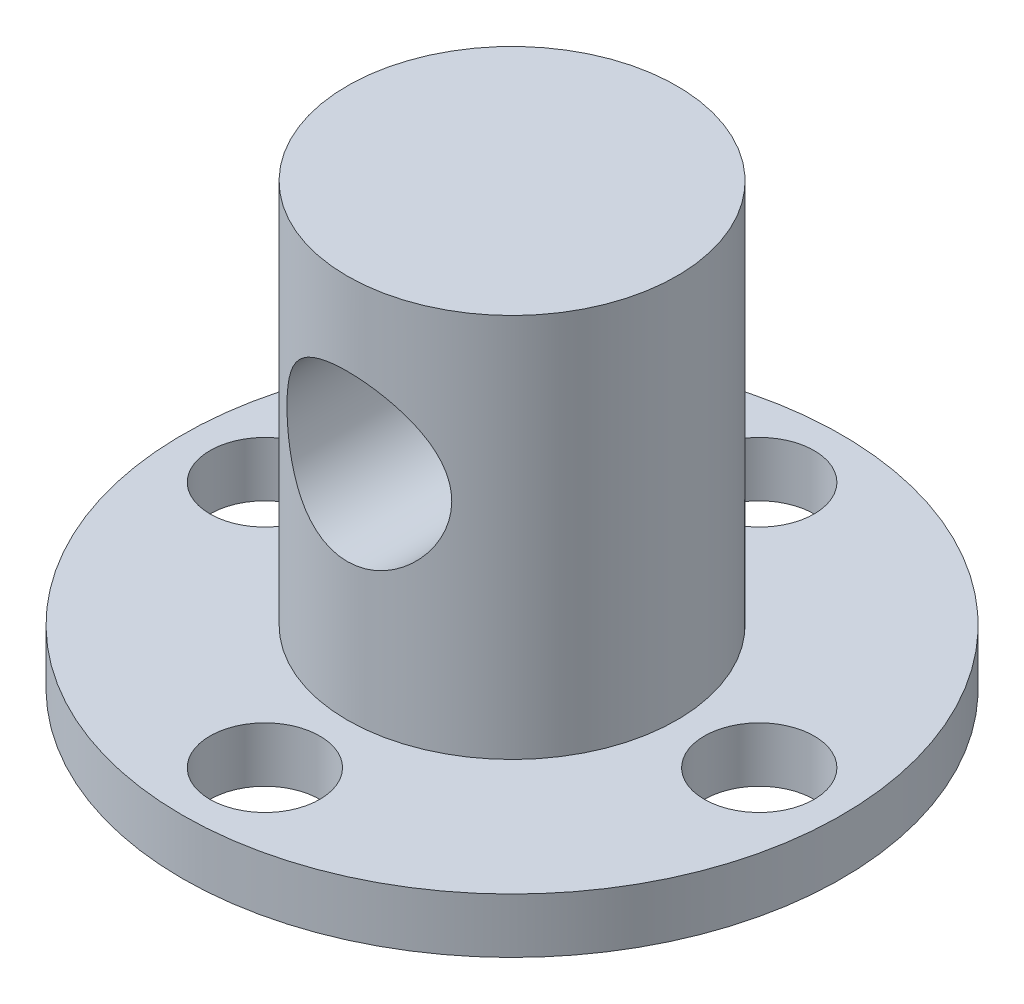
ISO-10303-21;
HEADER;
FILE_DESCRIPTION(('STEP AP214'),'2;1');
FILE_NAME('part.step','',(''),(''),'','','');
FILE_SCHEMA(('AUTOMOTIVE_DESIGN { 1 0 10303 214 1 1 1 1 }'));
ENDSEC;
DATA;
#1=APPLICATION_CONTEXT('core data for automotive mechanical design processes');
#2=APPLICATION_PROTOCOL_DEFINITION('international standard','automotive_design',2000,#1);
#3=PRODUCT_CONTEXT('',#1,'mechanical');
#4=PRODUCT('Part','Part','',(#3));
#5=PRODUCT_RELATED_PRODUCT_CATEGORY('part','',(#4));
#6=PRODUCT_DEFINITION_FORMATION('','',#4);
#7=PRODUCT_DEFINITION_CONTEXT('part definition',#1,'design');
#8=PRODUCT_DEFINITION('design','',#6,#7);
#9=PRODUCT_DEFINITION_SHAPE('','',#8);
#10=(LENGTH_UNIT() NAMED_UNIT(*) SI_UNIT(.MILLI.,.METRE.));
#11=(NAMED_UNIT(*) PLANE_ANGLE_UNIT() SI_UNIT($,.RADIAN.));
#12=(NAMED_UNIT(*) SI_UNIT($,.STERADIAN.) SOLID_ANGLE_UNIT());
#13=UNCERTAINTY_MEASURE_WITH_UNIT(LENGTH_MEASURE(1.E-05),#10,'distance_accuracy_value','');
#14=(GEOMETRIC_REPRESENTATION_CONTEXT(3) GLOBAL_UNCERTAINTY_ASSIGNED_CONTEXT((#13)) GLOBAL_UNIT_ASSIGNED_CONTEXT((#10,
#11,#12)) REPRESENTATION_CONTEXT('',''));
#15=CARTESIAN_POINT('',(0.,0.,0.));
#16=DIRECTION('',(0.,0.,1.));
#17=DIRECTION('',(1.,0.,0.));
#18=AXIS2_PLACEMENT_3D('',#15,#16,#17);
#19=CARTESIAN_POINT('',(0.,5.,0.));
#20=DIRECTION('',(0.,-1.,0.));
#21=DIRECTION('',(0.,0.,-1.));
#22=AXIS2_PLACEMENT_3D('',#19,#20,#21);
#23=CYLINDRICAL_SURFACE('',#22,30.);
#24=CARTESIAN_POINT('',(0.,5.,0.));
#25=DIRECTION('',(0.,1.,0.));
#26=DIRECTION('',(0.,0.,1.));
#27=AXIS2_PLACEMENT_3D('',#24,#25,#26);
#28=CIRCLE('',#27,30.);
#29=CARTESIAN_POINT('',(0.,5.,30.));
#30=VERTEX_POINT('',#29);
#31=EDGE_CURVE('E43',#30,#30,#28,.T.);
#32=ORIENTED_EDGE('',*,*,#31,.F.);
#33=EDGE_LOOP('',(#32));
#34=FACE_BOUND('',#33,.T.);
#35=CARTESIAN_POINT('',(0.,0.,0.));
#36=DIRECTION('',(0.,1.,0.));
#37=DIRECTION('',(0.,0.,1.));
#38=AXIS2_PLACEMENT_3D('',#35,#36,#37);
#39=CIRCLE('',#38,30.);
#40=CARTESIAN_POINT('',(0.,0.,30.));
#41=VERTEX_POINT('',#40);
#42=EDGE_CURVE('E47',#41,#41,#39,.T.);
#43=ORIENTED_EDGE('',*,*,#42,.T.);
#44=EDGE_LOOP('',(#43));
#45=FACE_BOUND('',#44,.T.);
#46=ADVANCED_FACE('F31',(#34,#45),#23,.T.);
#47=CARTESIAN_POINT('',(0.,5.,0.));
#48=DIRECTION('',(0.,1.,0.));
#49=DIRECTION('',(0.,0.,1.));
#50=AXIS2_PLACEMENT_3D('',#47,#48,#49);
#51=PLANE('',#50);
#52=CARTESIAN_POINT('',(0.,5.,0.));
#53=DIRECTION('',(0.,1.,0.));
#54=DIRECTION('',(0.,0.,1.));
#55=AXIS2_PLACEMENT_3D('',#52,#53,#54);
#56=CIRCLE('',#55,15.);
#57=CARTESIAN_POINT('',(0.,5.,15.));
#58=VERTEX_POINT('',#57);
#59=EDGE_CURVE('E95',#58,#58,#56,.T.);
#60=ORIENTED_EDGE('',*,*,#59,.F.);
#61=EDGE_LOOP('',(#60));
#62=FACE_BOUND('',#61,.T.);
#63=CARTESIAN_POINT('',(0.,5.,-22.5));
#64=DIRECTION('',(0.,1.,0.));
#65=DIRECTION('',(0.,0.,1.));
#66=AXIS2_PLACEMENT_3D('',#63,#64,#65);
#67=CIRCLE('',#66,5.);
#68=CARTESIAN_POINT('',(0.,5.,-17.5));
#69=VERTEX_POINT('',#68);
#70=EDGE_CURVE('E87',#69,#69,#67,.T.);
#71=ORIENTED_EDGE('',*,*,#70,.F.);
#72=EDGE_LOOP('',(#71));
#73=FACE_BOUND('',#72,.T.);
#74=CARTESIAN_POINT('',(22.5000000000003,5.,-3.50525861533354E-13));
#75=DIRECTION('',(0.,1.,0.));
#76=DIRECTION('',(0.,0.,1.));
#77=AXIS2_PLACEMENT_3D('',#74,#75,#76);
#78=CIRCLE('',#77,5.);
#79=CARTESIAN_POINT('',(22.5000000000003,5.,4.99999999999965));
#80=VERTEX_POINT('',#79);
#81=EDGE_CURVE('E100',#80,#80,#78,.T.);
#82=ORIENTED_EDGE('',*,*,#81,.F.);
#83=EDGE_LOOP('',(#82));
#84=FACE_BOUND('',#83,.T.);
#85=CARTESIAN_POINT('',(7.01051723066708E-13,5.,22.5));
#86=DIRECTION('',(0.,1.,0.));
#87=DIRECTION('',(0.,0.,1.));
#88=AXIS2_PLACEMENT_3D('',#85,#86,#87);
#89=CIRCLE('',#88,5.);
#90=CARTESIAN_POINT('',(7.01051723066708E-13,5.,27.5));
#91=VERTEX_POINT('',#90);
#92=EDGE_CURVE('E106',#91,#91,#89,.T.);
#93=ORIENTED_EDGE('',*,*,#92,.F.);
#94=EDGE_LOOP('',(#93));
#95=FACE_BOUND('',#94,.T.);
#96=CARTESIAN_POINT('',(-22.4999999999996,5.,3.53281316831436E-13));
#97=DIRECTION('',(0.,1.,0.));
#98=DIRECTION('',(0.,0.,1.));
#99=AXIS2_PLACEMENT_3D('',#96,#97,#98);
#100=CIRCLE('',#99,5.);
#101=CARTESIAN_POINT('',(-22.4999999999996,5.,5.00000000000035));
#102=VERTEX_POINT('',#101);
#103=EDGE_CURVE('E112',#102,#102,#100,.T.);
#104=ORIENTED_EDGE('',*,*,#103,.F.);
#105=EDGE_LOOP('',(#104));
#106=FACE_BOUND('',#105,.T.);
#107=ORIENTED_EDGE('',*,*,#31,.T.);
#108=EDGE_LOOP('',(#107));
#109=FACE_BOUND('',#108,.T.);
#110=ADVANCED_FACE('F72',(#62,#73,#84,#95,#106,#109),#51,.T.);
#111=CARTESIAN_POINT('',(0.,0.,0.));
#112=DIRECTION('',(0.,1.,0.));
#113=DIRECTION('',(0.,0.,1.));
#114=AXIS2_PLACEMENT_3D('',#111,#112,#113);
#115=PLANE('',#114);
#116=CARTESIAN_POINT('',(0.,0.,-22.5));
#117=DIRECTION('',(0.,1.,0.));
#118=DIRECTION('',(0.,0.,1.));
#119=AXIS2_PLACEMENT_3D('',#116,#117,#118);
#120=CIRCLE('',#119,5.);
#121=CARTESIAN_POINT('',(0.,0.,-17.5));
#122=VERTEX_POINT('',#121);
#123=EDGE_CURVE('E85',#122,#122,#120,.T.);
#124=ORIENTED_EDGE('',*,*,#123,.T.);
#125=EDGE_LOOP('',(#124));
#126=FACE_BOUND('',#125,.T.);
#127=CARTESIAN_POINT('',(22.5000000000003,0.,-3.50525861533354E-13));
#128=DIRECTION('',(0.,1.,0.));
#129=DIRECTION('',(0.,0.,1.));
#130=AXIS2_PLACEMENT_3D('',#127,#128,#129);
#131=CIRCLE('',#130,5.);
#132=CARTESIAN_POINT('',(22.5000000000003,0.,4.99999999999965));
#133=VERTEX_POINT('',#132);
#134=EDGE_CURVE('E92',#133,#133,#131,.T.);
#135=ORIENTED_EDGE('',*,*,#134,.T.);
#136=EDGE_LOOP('',(#135));
#137=FACE_BOUND('',#136,.T.);
#138=CARTESIAN_POINT('',(7.01051723066708E-13,0.,22.5));
#139=DIRECTION('',(0.,1.,0.));
#140=DIRECTION('',(0.,0.,1.));
#141=AXIS2_PLACEMENT_3D('',#138,#139,#140);
#142=CIRCLE('',#141,5.);
#143=CARTESIAN_POINT('',(7.01051723066708E-13,0.,27.5));
#144=VERTEX_POINT('',#143);
#145=EDGE_CURVE('E103',#144,#144,#142,.T.);
#146=ORIENTED_EDGE('',*,*,#145,.T.);
#147=EDGE_LOOP('',(#146));
#148=FACE_BOUND('',#147,.T.);
#149=CARTESIAN_POINT('',(-22.4999999999996,0.,3.53281316831436E-13));
#150=DIRECTION('',(0.,1.,0.));
#151=DIRECTION('',(0.,0.,1.));
#152=AXIS2_PLACEMENT_3D('',#149,#150,#151);
#153=CIRCLE('',#152,5.);
#154=CARTESIAN_POINT('',(-22.4999999999996,0.,5.00000000000035));
#155=VERTEX_POINT('',#154);
#156=EDGE_CURVE('E109',#155,#155,#153,.T.);
#157=ORIENTED_EDGE('',*,*,#156,.T.);
#158=EDGE_LOOP('',(#157));
#159=FACE_BOUND('',#158,.T.);
#160=ORIENTED_EDGE('',*,*,#42,.F.);
#161=EDGE_LOOP('',(#160));
#162=FACE_BOUND('',#161,.T.);
#163=ADVANCED_FACE('F77',(#126,#137,#148,#159,#162),#115,.F.);
#164=CARTESIAN_POINT('',(-22.4999999999996,0.,3.53281316831436E-13));
#165=DIRECTION('',(0.,1.,0.));
#166=DIRECTION('',(0.,0.,1.));
#167=AXIS2_PLACEMENT_3D('',#164,#165,#166);
#168=CYLINDRICAL_SURFACE('',#167,5.);
#169=ORIENTED_EDGE('',*,*,#156,.F.);
#170=EDGE_LOOP('',(#169));
#171=FACE_BOUND('',#170,.T.);
#172=ORIENTED_EDGE('',*,*,#103,.T.);
#173=EDGE_LOOP('',(#172));
#174=FACE_BOUND('',#173,.T.);
#175=ADVANCED_FACE('F137',(#171,#174),#168,.F.);
#176=CARTESIAN_POINT('',(7.01051723066708E-13,0.,22.5));
#177=DIRECTION('',(0.,1.,0.));
#178=DIRECTION('',(0.,0.,1.));
#179=AXIS2_PLACEMENT_3D('',#176,#177,#178);
#180=CYLINDRICAL_SURFACE('',#179,5.);
#181=ORIENTED_EDGE('',*,*,#145,.F.);
#182=EDGE_LOOP('',(#181));
#183=FACE_BOUND('',#182,.T.);
#184=ORIENTED_EDGE('',*,*,#92,.T.);
#185=EDGE_LOOP('',(#184));
#186=FACE_BOUND('',#185,.T.);
#187=ADVANCED_FACE('F134',(#183,#186),#180,.F.);
#188=CARTESIAN_POINT('',(22.5000000000003,0.,-3.50525861533354E-13));
#189=DIRECTION('',(0.,1.,0.));
#190=DIRECTION('',(0.,0.,1.));
#191=AXIS2_PLACEMENT_3D('',#188,#189,#190);
#192=CYLINDRICAL_SURFACE('',#191,5.);
#193=ORIENTED_EDGE('',*,*,#134,.F.);
#194=EDGE_LOOP('',(#193));
#195=FACE_BOUND('',#194,.T.);
#196=ORIENTED_EDGE('',*,*,#81,.T.);
#197=EDGE_LOOP('',(#196));
#198=FACE_BOUND('',#197,.T.);
#199=ADVANCED_FACE('F136',(#195,#198),#192,.F.);
#200=CARTESIAN_POINT('',(0.,0.,-22.5));
#201=DIRECTION('',(0.,1.,0.));
#202=DIRECTION('',(0.,0.,1.));
#203=AXIS2_PLACEMENT_3D('',#200,#201,#202);
#204=CYLINDRICAL_SURFACE('',#203,5.);
#205=ORIENTED_EDGE('',*,*,#123,.F.);
#206=EDGE_LOOP('',(#205));
#207=FACE_BOUND('',#206,.T.);
#208=ORIENTED_EDGE('',*,*,#70,.T.);
#209=EDGE_LOOP('',(#208));
#210=FACE_BOUND('',#209,.T.);
#211=ADVANCED_FACE('F68',(#207,#210),#204,.F.);
#212=CARTESIAN_POINT('',(0.,40.,0.));
#213=DIRECTION('',(0.,-1.,0.));
#214=DIRECTION('',(0.,0.,-1.));
#215=AXIS2_PLACEMENT_3D('',#212,#213,#214);
#216=CYLINDRICAL_SURFACE('',#215,15.);
#217=CARTESIAN_POINT('',(0.,32.5,-15.));
#218=CARTESIAN_POINT('',(-0.197233319634611,32.499999341654,-14.999999396748));
#219=CARTESIAN_POINT('',(-0.394480447697188,32.4922108377573,-14.9961007967494));
#220=CARTESIAN_POINT('',(-0.787521887153942,32.4611456581467,-14.9806046675974));
#221=CARTESIAN_POINT('',(-0.983315529042055,32.4378622445816,-14.9690037891684));
#222=CARTESIAN_POINT('',(-1.37217475867236,32.3760388485693,-14.9383810125726));
#223=CARTESIAN_POINT('',(-1.56523604806031,32.3374771113552,-14.9193485331296));
#224=CARTESIAN_POINT('',(-1.94703954292032,32.2455239578868,-14.8743407347001));
#225=CARTESIAN_POINT('',(-2.13577994705356,32.1921264743558,-14.8483625753491));
#226=CARTESIAN_POINT('',(-2.50682232648196,32.0713319041374,-14.7902312659494));
#227=CARTESIAN_POINT('',(-2.68914865467159,32.0039964765359,-14.7581053582234));
#228=CARTESIAN_POINT('',(-3.04717071465554,31.8558245945216,-14.6883654003789));
#229=CARTESIAN_POINT('',(-3.22286404618521,31.7749833091165,-14.6507493870819));
#230=CARTESIAN_POINT('',(-3.73833299838093,31.5133058044315,-14.5309652318162));
#231=CARTESIAN_POINT('',(-4.06690309396203,31.3131824899911,-14.4417945935421));
#232=CARTESIAN_POINT('',(-4.70640207469269,30.8535616950305,-14.2466964933283));
#233=CARTESIAN_POINT('',(-5.01506114711124,30.5912046579631,-14.1400816438171));
#234=CARTESIAN_POINT('',(-5.44308231880778,30.1636850023522,-13.9784212341451));
#235=CARTESIAN_POINT('',(-5.58001386248577,30.0153957286268,-13.9242051894336));
#236=CARTESIAN_POINT('',(-5.84165491097173,29.708054400909,-13.8164776143495));
#237=CARTESIAN_POINT('',(-5.96636238182052,29.5490005632221,-13.7629662024985));
#238=CARTESIAN_POINT('',(-6.21203614609388,29.2081027637479,-13.6539394008806));
#239=CARTESIAN_POINT('',(-6.33195448776317,29.0254486327018,-13.5985925588041));
#240=CARTESIAN_POINT('',(-6.5558172168629,28.6495328333444,-13.492094780061));
#241=CARTESIAN_POINT('',(-6.65976829479199,28.4562756541759,-13.4409420901999));
#242=CARTESIAN_POINT('',(-6.85079105860991,28.0602253984706,-13.3445910586524));
#243=CARTESIAN_POINT('',(-6.93786789550111,27.8574352555122,-13.2993909012604));
#244=CARTESIAN_POINT('',(-7.09420885808462,27.4435855881661,-13.2166574842323));
#245=CARTESIAN_POINT('',(-7.16347495754886,27.2325269830727,-13.1791233751457));
#246=CARTESIAN_POINT('',(-7.27969095551671,26.81656370687,-13.1152671777941));
#247=CARTESIAN_POINT('',(-7.32772731202127,26.61204530522,-13.088409003038));
#248=CARTESIAN_POINT('',(-7.40657415403486,26.1987126545535,-13.0439533148363));
#249=CARTESIAN_POINT('',(-7.43738537640827,25.9898985896951,-13.0263554052528));
#250=CARTESIAN_POINT('',(-7.48128583073153,25.5699890488967,-13.0011924893624));
#251=CARTESIAN_POINT('',(-7.49439005257303,25.3588956553363,-12.993618996979));
#252=CARTESIAN_POINT('',(-7.50270600478308,24.9362481207691,-12.9888194928446));
#253=CARTESIAN_POINT('',(-7.49791944225105,24.7246940256466,-12.9915924938538));
#254=CARTESIAN_POINT('',(-7.4721872371211,24.3284463588686,-13.0064057924061));
#255=CARTESIAN_POINT('',(-7.4532487913187,24.143574771867,-13.0172945533465));
#256=CARTESIAN_POINT('',(-7.40181622089091,23.7762705501265,-13.0466085215773));
#257=CARTESIAN_POINT('',(-7.36931761586149,23.5938387420938,-13.065036219764));
#258=CARTESIAN_POINT('',(-7.29114561844775,23.2327060817986,-13.1088213055836));
#259=CARTESIAN_POINT('',(-7.24547400171689,23.054004730169,-13.1341777592319));
#260=CARTESIAN_POINT('',(-7.14141020631304,22.701285292152,-13.1910489784068));
#261=CARTESIAN_POINT('',(-7.083012950831,22.5272691060997,-13.222566201213));
#262=CARTESIAN_POINT('',(-6.95255736213899,22.1809652803046,-13.2916331750086));
#263=CARTESIAN_POINT('',(-6.88021734471417,22.0088080124419,-13.3293043213991));
#264=CARTESIAN_POINT('',(-6.72336395223287,21.6711780704148,-13.4091058014596));
#265=CARTESIAN_POINT('',(-6.6388465328977,21.5057076405097,-13.4512376153395));
#266=CARTESIAN_POINT('',(-6.36789880537373,21.0204162252512,-13.5827161365204));
#267=CARTESIAN_POINT('',(-6.16401254035423,20.7115559327346,-13.6771793137099));
#268=CARTESIAN_POINT('',(-5.68542700201843,20.0910010807055,-13.8835116827651));
#269=CARTESIAN_POINT('',(-5.40502682962122,19.783912836628,-13.9960691755619));
#270=CARTESIAN_POINT('',(-4.9488124727457,19.3606371814819,-14.1610583156088));
#271=CARTESIAN_POINT('',(-4.79069598182254,19.225699194122,-14.2154461134507));
#272=CARTESIAN_POINT('',(-4.46319636456159,18.9689852051238,-14.3216433742747));
#273=CARTESIAN_POINT('',(-4.29381176943408,18.8472109248178,-14.3734524995837));
#274=CARTESIAN_POINT('',(-3.93649737411745,18.6123701181065,-14.4755004113358));
#275=CARTESIAN_POINT('',(-3.74807068630636,18.4999775677542,-14.5255523150678));
#276=CARTESIAN_POINT('',(-3.36104932929111,18.2916761079377,-14.6199518429338));
#277=CARTESIAN_POINT('',(-3.16245928376597,18.1957597878568,-14.6643020292947));
#278=CARTESIAN_POINT('',(-2.75644498721039,18.0214040648737,-14.7460120172744));
#279=CARTESIAN_POINT('',(-2.54902420588261,17.9429578718744,-14.7833745338763));
#280=CARTESIAN_POINT('',(-2.12686703288174,17.8044619712916,-14.8499857401209));
#281=CARTESIAN_POINT('',(-1.91213148593978,17.7444101474207,-14.8792353631224));
#282=CARTESIAN_POINT('',(-1.49520060410314,17.6477005910272,-14.9266434935569));
#283=CARTESIAN_POINT('',(-1.29343993576981,17.6095170641766,-14.9455200325964));
#284=CARTESIAN_POINT('',(-0.886879460889924,17.549788635032,-14.9751451894528));
#285=CARTESIAN_POINT('',(-0.682079820268399,17.5282428277162,-14.9858942493696));
#286=CARTESIAN_POINT('',(-0.271216089694754,17.5020802581073,-14.9989557072523));
#287=CARTESIAN_POINT('',(-0.0651525383335482,17.4974567271315,-15.0012714784182));
#288=CARTESIAN_POINT('',(0.346571468999544,17.5051833923449,-14.9974085489777));
#289=CARTESIAN_POINT('',(0.552231942407394,17.5175328373464,-14.9912302243018));
#290=CARTESIAN_POINT('',(0.945483703972704,17.557417675707,-14.9713647745727));
#291=CARTESIAN_POINT('',(1.13323569327501,17.5836965442796,-14.9582993834851));
#292=CARTESIAN_POINT('',(1.5057028354874,17.6502612153465,-14.9254086100729));
#293=CARTESIAN_POINT('',(1.69041693509205,17.6905517730799,-14.9055809328309));
#294=CARTESIAN_POINT('',(2.05548161642884,17.7847023066896,-14.8596377637143));
#295=CARTESIAN_POINT('',(2.23583357633264,17.8385579337904,-14.8335242870997));
#296=CARTESIAN_POINT('',(2.59122720556856,17.9593477059504,-14.7755872196551));
#297=CARTESIAN_POINT('',(2.76626677748716,18.0262869409735,-14.743761406929));
#298=CARTESIAN_POINT('',(3.11487231777693,18.1747192448521,-14.6741281629767));
#299=CARTESIAN_POINT('',(3.28825774429608,18.2565692973588,-14.636177437618));
#300=CARTESIAN_POINT('',(3.62748137850217,18.4328126701688,-14.5558172256269));
#301=CARTESIAN_POINT('',(3.79331700210343,18.5272102424433,-14.5134062285665));
#302=CARTESIAN_POINT('',(4.27827609975167,18.8282076145844,-14.3808355856942));
#303=CARTESIAN_POINT('',(4.58503393852599,19.0526902505338,-14.2853004428519));
#304=CARTESIAN_POINT('',(5.18834638761034,19.5682754065004,-14.0780904901238));
#305=CARTESIAN_POINT('',(5.48094083116618,19.8637552816684,-13.9657520358616));
#306=CARTESIAN_POINT('',(5.88061884377912,20.340444988006,-13.7999731666702));
#307=CARTESIAN_POINT('',(6.00738638095381,20.5050505178604,-13.7451298302383));
#308=CARTESIAN_POINT('',(6.24720364816647,20.8448036331072,-13.6378032341987));
#309=CARTESIAN_POINT('',(6.36025132582032,21.0199527898958,-13.5853203284304));
#310=CARTESIAN_POINT('',(6.57696128828773,21.3886946069377,-13.4817918944242));
#311=CARTESIAN_POINT('',(6.67989625516331,21.5827702091917,-13.430941525462));
#312=CARTESIAN_POINT('',(6.86878239405518,21.980358898624,-13.3353302893677));
#313=CARTESIAN_POINT('',(6.95474175273572,22.1838673779432,-13.2905664901843));
#314=CARTESIAN_POINT('',(7.10870779446041,22.5989123974298,-13.2088558963579));
#315=CARTESIAN_POINT('',(7.17672888846674,22.8104423362053,-13.1719028316166));
#316=CARTESIAN_POINT('',(7.29397564807538,23.2400374115257,-13.1073420248173));
#317=CARTESIAN_POINT('',(7.3432042238577,23.4581015305522,-13.0797328358565));
#318=CARTESIAN_POINT('',(7.41830673858422,23.8776435975368,-13.0372695609292));
#319=CARTESIAN_POINT('',(7.4459689347645,24.0787043160051,-13.021445483554));
#320=CARTESIAN_POINT('',(7.48490769106324,24.4829204944751,-12.9991026119521));
#321=CARTESIAN_POINT('',(7.49618536553766,24.6860758110709,-12.9925831848914));
#322=CARTESIAN_POINT('',(7.50218225151114,25.0926351766783,-12.9891213170173));
#323=CARTESIAN_POINT('',(7.49690758753643,25.2960391058605,-12.9921753339361));
#324=CARTESIAN_POINT('',(7.469894240452,25.7013790823052,-13.0077254939855));
#325=CARTESIAN_POINT('',(7.44815623134422,25.9033151893179,-13.0202212505754));
#326=CARTESIAN_POINT('',(7.39139793729182,26.28483573048,-13.0525163509744));
#327=CARTESIAN_POINT('',(7.35784677050872,26.4647108011513,-13.0715029011715));
#328=CARTESIAN_POINT('',(7.27791219467992,26.8207966963092,-13.116176635625));
#329=CARTESIAN_POINT('',(7.23152452505277,26.9970062832653,-13.1418660444746));
#330=CARTESIAN_POINT('',(7.12639386444851,27.3446730600835,-13.1991699931078));
#331=CARTESIAN_POINT('',(7.06765252360368,27.5161308812008,-13.230783741491));
#332=CARTESIAN_POINT('',(6.93829971844233,27.8535340805497,-13.2990730578631));
#333=CARTESIAN_POINT('',(6.86768365648883,28.0194772937253,-13.3357505854505));
#334=CARTESIAN_POINT('',(6.71002238040005,28.3559476361139,-13.4158088277434));
#335=CARTESIAN_POINT('',(6.62219479035092,28.5260404563591,-13.4594736551205));
#336=CARTESIAN_POINT('',(6.43424064207575,28.8583683761912,-13.5503300057645));
#337=CARTESIAN_POINT('',(6.33410990987667,29.0206007828768,-13.5975227237682));
#338=CARTESIAN_POINT('',(6.1221384721123,29.3365444384223,-13.6942686473789));
#339=CARTESIAN_POINT('',(6.01029468923604,29.4902534316636,-13.7438224714345));
#340=CARTESIAN_POINT('',(5.77548095727846,29.7885122411326,-13.8441367211459));
#341=CARTESIAN_POINT('',(5.65251024494257,29.9330614278829,-13.8948972293982));
#342=CARTESIAN_POINT('',(5.38035188500559,30.2294424976712,-14.0027054261897));
#343=CARTESIAN_POINT('',(5.22979541793192,30.3800162208007,-14.059765681286));
#344=CARTESIAN_POINT('',(4.91618955858278,30.6680147738775,-14.1724674726751));
#345=CARTESIAN_POINT('',(4.75314382541697,30.805443428738,-14.2281094181856));
#346=CARTESIAN_POINT('',(4.41516652803151,31.0664597589284,-14.3365905676768));
#347=CARTESIAN_POINT('',(4.24022347499011,31.19003374141,-14.3894269722129));
#348=CARTESIAN_POINT('',(3.87959731338854,31.42220279211,-14.4908173199864));
#349=CARTESIAN_POINT('',(3.69391915105051,31.5308046819024,-14.5393732098487));
#350=CARTESIAN_POINT('',(3.31135574476216,31.7329099670393,-14.631264866461));
#351=CARTESIAN_POINT('',(3.11439541624588,31.8262910687231,-14.6745577030524));
#352=CARTESIAN_POINT('',(2.71198022789958,31.9959137797311,-14.7542266224256));
#353=CARTESIAN_POINT('',(2.50652960021848,32.0721638092108,-14.7906061018549));
#354=CARTESIAN_POINT('',(2.08904591147875,32.206515609731,-14.8553158088887));
#355=CARTESIAN_POINT('',(1.87702833672873,32.2646569630485,-14.8836635799129));
#356=CARTESIAN_POINT('',(1.44785490772256,32.362207070422,-14.9315196572219));
#357=CARTESIAN_POINT('',(1.23070227758585,32.4016272673375,-14.9510333627761));
#358=CARTESIAN_POINT('',(0.844562643439674,32.4542116766798,-14.9771457489839));
#359=CARTESIAN_POINT('',(0.676238758375201,32.4713675980573,-14.9857011054743));
#360=CARTESIAN_POINT('',(0.338613325294022,32.4942621998569,-14.9971285683414));
#361=CARTESIAN_POINT('',(0.169311750421737,32.5000005651465,-15.0000005178519));
#362=CARTESIAN_POINT('',(0.,32.5,-15.));
#363=B_SPLINE_CURVE_WITH_KNOTS('',3,(#217,#218,#219,#220,#221,#222,#223,#224,#225,#226,#227,
#228,#229,#230,#231,#232,#233,#234,#235,#236,#237,#238,#239,#240,#241,#242,#243,#244,#245,#246,
#247,#248,#249,#250,#251,#252,#253,#254,#255,#256,#257,#258,#259,#260,#261,#262,#263,#264,#265,
#266,#267,#268,#269,#270,#271,#272,#273,#274,#275,#276,#277,#278,#279,#280,#281,#282,#283,#284,
#285,#286,#287,#288,#289,#290,#291,#292,#293,#294,#295,#296,#297,#298,#299,#300,#301,#302,#303,
#304,#305,#306,#307,#308,#309,#310,#311,#312,#313,#314,#315,#316,#317,#318,#319,#320,#321,#322,
#323,#324,#325,#326,#327,#328,#329,#330,#331,#332,#333,#334,#335,#336,#337,#338,#339,#340,#341,
#342,#343,#344,#345,#346,#347,#348,#349,#350,#351,#352,#353,#354,#355,#356,#357,#358,#359,#360,
#361,#362),.UNSPECIFIED.,.T.,.F.,(4,2,2,2,2,2,2,2,2,2,2,2,2,2,2,2,2,2,2,2,2,2,2,2,2,2,2,2,2,2,2,
2,2,2,2,2,2,2,2,2,2,2,2,2,2,2,2,2,2,2,2,2,2,2,2,2,2,2,2,2,2,2,2,2,2,2,2,2,2,2,2,2,4),(0.,
0.591532941974834,1.18332327605672,1.77595930484633,2.36883805772764,2.95914801973938,
3.5496695871672,4.72943162533672,5.98056661136063,6.60703434534514,7.23360614076149,
7.90898079290037,8.58407167742325,9.25895615909367,9.93376581833203,10.568238808629,
11.2026846550832,11.8365930731243,12.4704410065579,13.028257193232,13.5862578337467,
14.1441832938005,14.7023317433305,15.273234855264,15.8443280107123,16.9859990925924,
18.2724305981167,18.9164473004745,19.5605481150863,20.2347844625213,20.9087167558919,
21.5823866537383,22.2559790161609,22.8737744253103,23.4915362266238,24.109050904515,
24.7265382534065,25.2959739410995,25.8656030708237,26.4350498171613,27.0047185399872,
27.5904412613962,28.176362974779,29.3476075788121,30.6338695709977,31.2779290064003,
31.9220846696311,32.5976781105397,33.2729449395212,33.9476676191321,34.6222857698159,
35.2321453015405,35.841963353115,36.4515557926873,37.0611232771687,37.6123930023859,
38.1638459202211,38.7152252248815,39.2668185053849,39.8552593497835,40.4439003831458,
41.0326964570339,41.6215329502021,42.282105969062,42.942486187842,43.6035134248763,
44.2642384827035,44.9300352143687,45.5955039784387,46.2595077713263,46.9231051837462,
47.4308830472037,47.9386749254899),.UNSPECIFIED.);
#364=CARTESIAN_POINT('',(0.,32.5,-15.));
#365=VERTEX_POINT('',#364);
#366=EDGE_CURVE('E34',#365,#365,#363,.T.);
#367=ORIENTED_EDGE('',*,*,#366,.T.);
#368=EDGE_LOOP('',(#367));
#369=FACE_BOUND('',#368,.T.);
#370=CARTESIAN_POINT('',(7.5,25.,12.9903810567666));
#371=CARTESIAN_POINT('',(7.49999915219101,24.8045027075097,12.990382181035));
#372=CARTESIAN_POINT('',(7.49234594296004,24.6089883720944,12.9948093228963));
#373=CARTESIAN_POINT('',(7.46183346896063,24.219466437664,13.0123535007346));
#374=CARTESIAN_POINT('',(7.43896712498941,24.0254595826722,13.0254745822937));
#375=CARTESIAN_POINT('',(7.37828654739347,23.6402324466903,13.0599426771176));
#376=CARTESIAN_POINT('',(7.34044887204588,23.4490170256547,13.0813025892036));
#377=CARTESIAN_POINT('',(7.25028327630329,23.0709635217319,13.1314907641568));
#378=CARTESIAN_POINT('',(7.19794905465278,22.8841273807909,13.1603222743731));
#379=CARTESIAN_POINT('',(7.0797153930125,22.5171446145992,13.2243001063235));
#380=CARTESIAN_POINT('',(7.01389642712031,22.3369654640602,13.2594088156932));
#381=CARTESIAN_POINT('',(6.86912607915748,21.9830973775755,13.3349831889209));
#382=CARTESIAN_POINT('',(6.79016961496391,21.8094109852621,13.3754509246287));
#383=CARTESIAN_POINT('',(6.53458165294547,21.2995135638977,13.5031657459223));
#384=CARTESIAN_POINT('',(6.33911850533735,20.9741170450986,13.5967885797889));
#385=CARTESIAN_POINT('',(5.88499039409602,20.332657055592,13.7997722488749));
#386=CARTESIAN_POINT('',(5.62244233404368,20.0195769022991,13.9097942423497));
#387=CARTESIAN_POINT('',(5.04935146826095,19.4394166569477,14.1279092446598));
#388=CARTESIAN_POINT('',(4.73878486768894,19.1723595103701,14.236001267344));
#389=CARTESIAN_POINT('',(4.23049481242522,18.8031564517859,14.3922677411176));
#390=CARTESIAN_POINT('',(4.04756743682242,18.6821262489861,14.4449049107873));
#391=CARTESIAN_POINT('',(3.67082661069008,18.456054541473,14.5452036331898));
#392=CARTESIAN_POINT('',(3.47701785131803,18.3510062180578,14.5928673051336));
#393=CARTESIAN_POINT('',(3.07976082483332,18.1579355059535,14.6818428286494));
#394=CARTESIAN_POINT('',(2.8763149183124,18.0699089743988,14.723156225286));
#395=CARTESIAN_POINT('',(2.46119546749128,17.9118535156351,14.7982086294623));
#396=CARTESIAN_POINT('',(2.24952279985797,17.8418226767751,14.8319484414824));
#397=CARTESIAN_POINT('',(1.83496193120693,17.724978238187,14.8887046642508));
#398=CARTESIAN_POINT('',(1.63251998867097,17.6768674257841,14.9123131648937));
#399=CARTESIAN_POINT('',(1.2235749234957,17.5975520473387,14.9514227342515));
#400=CARTESIAN_POINT('',(1.01707197783208,17.5663467462504,14.9669241554582));
#401=CARTESIAN_POINT('',(0.601825595664967,17.5212701222078,14.9893635097996));
#402=CARTESIAN_POINT('',(0.393083355690408,17.507389965861,14.9963058068642));
#403=CARTESIAN_POINT('',(-0.0249331184730588,17.4971285345752,15.0014351981526));
#404=CARTESIAN_POINT('',(-0.234207319330798,17.5007461890299,14.9996228280321));
#405=CARTESIAN_POINT('',(-0.633235066994358,17.5243456592291,14.9878390819988));
#406=CARTESIAN_POINT('',(-0.823098331279896,17.5428718157591,14.9785935489249));
#407=CARTESIAN_POINT('',(-1.20046493644169,17.5942485270567,14.953081841927));
#408=CARTESIAN_POINT('',(-1.38796745628717,17.6271039310508,14.9368132913303));
#409=CARTESIAN_POINT('',(-1.75920233284615,17.706767666258,14.8976520521443));
#410=CARTESIAN_POINT('',(-1.9429359810001,17.7535711296905,14.8747616746105));
#411=CARTESIAN_POINT('',(-2.30560974309449,17.8606769177693,14.8228789596523));
#412=CARTESIAN_POINT('',(-2.48454796248766,17.9209844920072,14.793884249491));
#413=CARTESIAN_POINT('',(-2.83889506276332,18.0554296415602,14.7300206386001));
#414=CARTESIAN_POINT('',(-3.01422444013302,18.1297418277404,14.695078180897));
#415=CARTESIAN_POINT('',(-3.35792342376137,18.291019179494,14.6203739158272));
#416=CARTESIAN_POINT('',(-3.52629066033773,18.3779886083871,14.5806104853759));
#417=CARTESIAN_POINT('',(-4.01963951499522,18.6568860352739,14.4553576002534));
#418=CARTESIAN_POINT('',(-4.33307864865502,18.8668837080235,14.3638660854075));
#419=CARTESIAN_POINT('',(-4.95139135165847,19.3517800055694,14.1633050914297));
#420=CARTESIAN_POINT('',(-5.25265452762021,19.6309371291114,14.0533915290052));
#421=CARTESIAN_POINT('',(-5.66743502568295,20.0834783971829,13.8889325397243));
#422=CARTESIAN_POINT('',(-5.79959345558814,20.2400881113365,13.8341410663629));
#423=CARTESIAN_POINT('',(-6.05093566976302,20.5639910842674,13.7260650185139));
#424=CARTESIAN_POINT('',(-6.17011742175538,20.7312860099651,13.6727806810234));
#425=CARTESIAN_POINT('',(-6.4019009242339,21.0867503982969,13.5658760225877));
#426=CARTESIAN_POINT('',(-6.51359631862866,21.2755706607267,13.5124515808189));
#427=CARTESIAN_POINT('',(-6.72046150393887,21.6632882439877,13.4107672748936));
#428=CARTESIAN_POINT('',(-6.81563874962026,21.8621809664121,13.3625050847668));
#429=CARTESIAN_POINT('',(-6.98851428950619,22.2688021742505,13.2729104159533));
#430=CARTESIAN_POINT('',(-7.06622290622511,22.4765253548362,13.2315738484945));
#431=CARTESIAN_POINT('',(-7.20326332887099,22.8994328425998,13.1574724129662));
#432=CARTESIAN_POINT('',(-7.26259764057921,23.1146161279573,13.1247063761921));
#433=CARTESIAN_POINT('',(-7.35808542088784,23.533378548511,13.0713934707128));
#434=CARTESIAN_POINT('',(-7.39570258614447,23.7365270358091,13.0500843955535));
#435=CARTESIAN_POINT('',(-7.45408812476478,24.1459943117538,13.01682404884));
#436=CARTESIAN_POINT('',(-7.47485745026629,24.3523129205727,13.0048722484707));
#437=CARTESIAN_POINT('',(-7.49921791198354,24.7661730074824,12.9908402257778));
#438=CARTESIAN_POINT('',(-7.50281942614748,24.9737136708422,12.9887540396929));
#439=CARTESIAN_POINT('',(-7.49281311131347,25.3882321848457,12.9945291406031));
#440=CARTESIAN_POINT('',(-7.47920644393669,25.5952100725339,13.0023897561492));
#441=CARTESIAN_POINT('',(-7.43743545480093,25.9841272962415,13.0263214416929));
#442=CARTESIAN_POINT('',(-7.41103301062551,26.166321224041,13.0413965730853));
#443=CARTESIAN_POINT('',(-7.34507135546585,26.5276319936526,13.0786605468612));
#444=CARTESIAN_POINT('',(-7.30550779326209,26.7067477971772,13.1008517418108));
#445=CARTESIAN_POINT('',(-7.21365869037155,27.0607188080837,13.1516491814642));
#446=CARTESIAN_POINT('',(-7.16137480480641,27.2355745665134,13.1802545915359));
#447=CARTESIAN_POINT('',(-7.04455822855378,27.580177364355,13.2430583471052));
#448=CARTESIAN_POINT('',(-6.9800207575778,27.749922379956,13.2772588746105));
#449=CARTESIAN_POINT('',(-6.83600462250947,28.0910973803053,13.3520005151611));
#450=CARTESIAN_POINT('',(-6.75597608169156,28.262247016584,13.392760622743));
#451=CARTESIAN_POINT('',(-6.58369023646962,28.5972939685771,13.4782889012486));
#452=CARTESIAN_POINT('',(-6.4914288250574,28.7611888238457,13.523058416627));
#453=CARTESIAN_POINT('',(-6.29525608536943,29.0810486760147,13.6154877679512));
#454=CARTESIAN_POINT('',(-6.19134185521638,29.2370116835457,13.6631483224838));
#455=CARTESIAN_POINT('',(-5.97243402893727,29.5403772357573,13.7602460013661));
#456=CARTESIAN_POINT('',(-5.85743970861164,29.6877792198751,13.8096832417081));
#457=CARTESIAN_POINT('',(-5.60169452099004,29.9915182010462,13.9155491573882));
#458=CARTESIAN_POINT('',(-5.45952512014944,30.146630966318,13.9720719689066));
#459=CARTESIAN_POINT('',(-5.16258673777422,30.4444378975743,14.0844912504233));
#460=CARTESIAN_POINT('',(-5.00782116373766,30.5871354006479,14.1403878851899));
#461=CARTESIAN_POINT('',(-4.68629256911222,30.8594430817377,14.2501767276826));
#462=CARTESIAN_POINT('',(-4.51952082941853,30.9890435808901,14.30406743469));
#463=CARTESIAN_POINT('',(-4.17498562481308,31.2341130296958,14.4083960180679));
#464=CARTESIAN_POINT('',(-3.99722686865767,31.3495879708529,14.4588353543454));
#465=CARTESIAN_POINT('',(-3.62665426587057,31.568479569685,14.5562721242768));
#466=CARTESIAN_POINT('',(-3.43356346802265,31.6714863050813,14.6031397998663));
#467=CARTESIAN_POINT('',(-3.03801844269129,31.8606468449099,14.6905221014912));
#468=CARTESIAN_POINT('',(-2.8355686750039,31.9468085761322,14.7310397139005));
#469=CARTESIAN_POINT('',(-2.42275459239429,32.1013242697962,14.8045326784762));
#470=CARTESIAN_POINT('',(-2.21239399580206,32.169686481729,14.8375115237449));
#471=CARTESIAN_POINT('',(-1.7853699767944,32.2877643040495,14.8949267083421));
#472=CARTESIAN_POINT('',(-1.56870730506275,32.3374821255775,14.9193640606296));
#473=CARTESIAN_POINT('',(-1.15110375492591,32.4138921472166,14.9570987709583));
#474=CARTESIAN_POINT('',(-0.950545284981382,32.4422790002478,14.9712127859299));
#475=CARTESIAN_POINT('',(-0.547388996951627,32.4827400244678,14.9913670911193));
#476=CARTESIAN_POINT('',(-0.344791309117527,32.4948152309535,14.9974078937421));
#477=CARTESIAN_POINT('',(0.0607319557057442,32.5024948707214,15.0012472475445));
#478=CARTESIAN_POINT('',(0.263657416995004,32.4981042111284,14.9990482543318));
#479=CARTESIAN_POINT('',(0.668228678158472,32.4729207472989,14.9864747243643));
#480=CARTESIAN_POINT('',(0.869874513106668,32.4521283946,14.9761004126756));
#481=CARTESIAN_POINT('',(1.25700134962122,32.3963252995275,14.9484141785526));
#482=CARTESIAN_POINT('',(1.44266872616872,32.3623469941372,14.9316070193227));
#483=CARTESIAN_POINT('',(1.81031162182535,32.2806758788685,14.8915068164159));
#484=CARTESIAN_POINT('',(1.99228585873567,32.2329783902505,14.8682115601484));
#485=CARTESIAN_POINT('',(2.35129713393641,32.124364218719,14.8156777873291));
#486=CARTESIAN_POINT('',(2.52833560154831,32.0634514085846,14.7864410121111));
#487=CARTESIAN_POINT('',(2.87660018897091,31.9289275567787,14.7226536726119));
#488=CARTESIAN_POINT('',(3.04782401602415,31.8553115741573,14.6881010412765));
#489=CARTESIAN_POINT('',(3.39064537651026,31.6926097902611,14.6128573725765));
#490=CARTESIAN_POINT('',(3.56195129753749,31.6030006486542,14.5719682662374));
#491=CARTESIAN_POINT('',(3.89641126112142,31.4113309885696,14.4861257520595));
#492=CARTESIAN_POINT('',(4.05956249787545,31.309266225463,14.4411709600745));
#493=CARTESIAN_POINT('',(4.53562791530357,30.9854248936619,14.3016508219336));
#494=CARTESIAN_POINT('',(4.83532115334169,30.7459212805711,14.2023915191712));
#495=CARTESIAN_POINT('',(5.42194343509695,30.1989391044336,13.9896182489816));
#496=CARTESIAN_POINT('',(5.70463394069456,29.8870677692331,13.8756687454419));
#497=CARTESIAN_POINT('',(6.0873218915051,29.38620676034,13.7099949874917));
#498=CARTESIAN_POINT('',(6.20807712903994,29.2135853877232,13.6556020697553));
#499=CARTESIAN_POINT('',(6.43508648513724,28.8579952391583,13.5501034682427));
#500=CARTESIAN_POINT('',(6.54133858592571,28.6750250284085,13.4989982423941));
#501=CARTESIAN_POINT('',(6.74160896775215,28.293715946619,13.4001340435359));
#502=CARTESIAN_POINT('',(6.83512717738288,28.0950726809079,13.352534408331));
#503=CARTESIAN_POINT('',(7.00478946882536,27.6891046378023,13.2643156538703));
#504=CARTESIAN_POINT('',(7.08094249897425,27.4817843971686,13.2236929420577));
#505=CARTESIAN_POINT('',(7.21481348107953,27.0603914348381,13.1511314354761));
#506=CARTESIAN_POINT('',(7.27257885859355,26.8463376750482,13.1191703328352));
#507=CARTESIAN_POINT('',(7.36906123355885,26.4128609192236,13.0652214956916));
#508=CARTESIAN_POINT('',(7.40779154896141,26.1934417902437,13.0432267890063));
#509=CARTESIAN_POINT('',(7.45773453230136,25.8115033248405,13.0147131582628));
#510=CARTESIAN_POINT('',(7.47356894324815,25.6497637545553,13.0056107894155));
#511=CARTESIAN_POINT('',(7.49470238224566,25.3253534311261,12.9934440689235));
#512=CARTESIAN_POINT('',(7.50000070550228,25.162682616418,12.9903801212092));
#513=CARTESIAN_POINT('',(7.5,25.,12.9903810567666));
#514=B_SPLINE_CURVE_WITH_KNOTS('',3,(#370,#371,#372,#373,#374,#375,#376,#377,#378,#379,#380,
#381,#382,#383,#384,#385,#386,#387,#388,#389,#390,#391,#392,#393,#394,#395,#396,#397,#398,#399,
#400,#401,#402,#403,#404,#405,#406,#407,#408,#409,#410,#411,#412,#413,#414,#415,#416,#417,#418,
#419,#420,#421,#422,#423,#424,#425,#426,#427,#428,#429,#430,#431,#432,#433,#434,#435,#436,#437,
#438,#439,#440,#441,#442,#443,#444,#445,#446,#447,#448,#449,#450,#451,#452,#453,#454,#455,#456,
#457,#458,#459,#460,#461,#462,#463,#464,#465,#466,#467,#468,#469,#470,#471,#472,#473,#474,#475,
#476,#477,#478,#479,#480,#481,#482,#483,#484,#485,#486,#487,#488,#489,#490,#491,#492,#493,#494,
#495,#496,#497,#498,#499,#500,#501,#502,#503,#504,#505,#506,#507,#508,#509,#510,#511,#512,#513),
.UNSPECIFIED.,.T.,.F.,(4,2,2,2,2,2,2,2,2,2,2,2,2,2,2,2,2,2,2,2,2,2,2,2,2,2,2,2,2,2,2,2,2,2,2,2,
2,2,2,2,2,2,2,2,2,2,2,2,2,2,2,2,2,2,2,2,2,2,2,2,2,2,2,2,2,2,2,2,2,2,2,4),(0.,0.586323576834727,
1.17292018151066,1.76043892185672,2.34821344249715,2.93257740658585,3.51716795442696,
4.68524892593732,5.94967082883545,7.21472131642653,7.89069130478282,8.5663720754337,
9.24188818729898,9.91733251057597,10.5447278994445,11.1720960071843,11.7991441143986,
12.4261538560646,12.9984442136809,13.5709283931728,14.1432130129766,14.7157204902737,
15.2959050840961,15.876285554844,17.0363679012783,18.3061098092582,18.9419219109117,
19.5778334442978,20.2543578506447,20.930576137907,21.6063937795331,22.2821192164369,
22.904329323652,23.5265042648717,24.1483030533765,24.7700598702128,25.3235688877657,
25.877261084045,26.4308812744283,26.9847178849066,27.5639783078045,28.1434337037449,
28.7230337220619,29.3026716490211,29.9555467841243,30.6082458877317,31.2614238706273,
31.9143238334087,32.584858068982,33.2550760062918,33.9249827644989,34.5948100496521,
35.2031527379992,35.8114568131385,36.4195796171099,37.0276856800811,37.5955330309729,
38.163574268506,38.73144926462,39.2995456379105,39.8917147636491,40.4840862553716,
41.6682672089651,42.9702980901662,43.62240841601,44.2746093755581,44.9476734677058,
45.6203899398507,46.2913570079876,46.961853960875,47.4497291246447,47.9376369229166),.UNSPECIFIED.);
#515=CARTESIAN_POINT('',(7.5,25.,12.9903810567666));
#516=VERTEX_POINT('',#515);
#517=EDGE_CURVE('E10',#516,#516,#514,.T.);
#518=ORIENTED_EDGE('',*,*,#517,.T.);
#519=EDGE_LOOP('',(#518));
#520=FACE_BOUND('',#519,.T.);
#521=CARTESIAN_POINT('',(0.,40.,0.));
#522=DIRECTION('',(0.,1.,0.));
#523=DIRECTION('',(0.,0.,1.));
#524=AXIS2_PLACEMENT_3D('',#521,#522,#523);
#525=CIRCLE('',#524,15.);
#526=CARTESIAN_POINT('',(0.,40.,15.));
#527=VERTEX_POINT('',#526);
#528=EDGE_CURVE('E114',#527,#527,#525,.T.);
#529=ORIENTED_EDGE('',*,*,#528,.F.);
#530=EDGE_LOOP('',(#529));
#531=FACE_BOUND('',#530,.T.);
#532=ORIENTED_EDGE('',*,*,#59,.T.);
#533=EDGE_LOOP('',(#532));
#534=FACE_BOUND('',#533,.T.);
#535=ADVANCED_FACE('F53',(#369,#520,#531,#534),#216,.T.);
#536=CARTESIAN_POINT('',(0.,40.,0.));
#537=DIRECTION('',(0.,1.,0.));
#538=DIRECTION('',(0.,0.,1.));
#539=AXIS2_PLACEMENT_3D('',#536,#537,#538);
#540=PLANE('',#539);
#541=ORIENTED_EDGE('',*,*,#528,.T.);
#542=EDGE_LOOP('',(#541));
#543=FACE_BOUND('',#542,.T.);
#544=ADVANCED_FACE('F60',(#543),#540,.T.);
#545=CARTESIAN_POINT('',(0.,25.,-30.));
#546=DIRECTION('',(0.,0.,1.));
#547=DIRECTION('',(1.,0.,0.));
#548=AXIS2_PLACEMENT_3D('',#545,#546,#547);
#549=CYLINDRICAL_SURFACE('',#548,7.5);
#550=ORIENTED_EDGE('',*,*,#517,.F.);
#551=EDGE_LOOP('',(#550));
#552=FACE_BOUND('',#551,.T.);
#553=ORIENTED_EDGE('',*,*,#366,.F.);
#554=EDGE_LOOP('',(#553));
#555=FACE_BOUND('',#554,.T.);
#556=ADVANCED_FACE('F57',(#552,#555),#549,.F.);
#557=CLOSED_SHELL('',(#46,#110,#163,#175,#187,#199,#211,#535,#544,#556));
#558=MANIFOLD_SOLID_BREP('B2',#557);
#559=ADVANCED_BREP_SHAPE_REPRESENTATION('',(#18,#558),#14);
#560=SHAPE_DEFINITION_REPRESENTATION(#9,#559);
ENDSEC;
END-ISO-10303-21;
